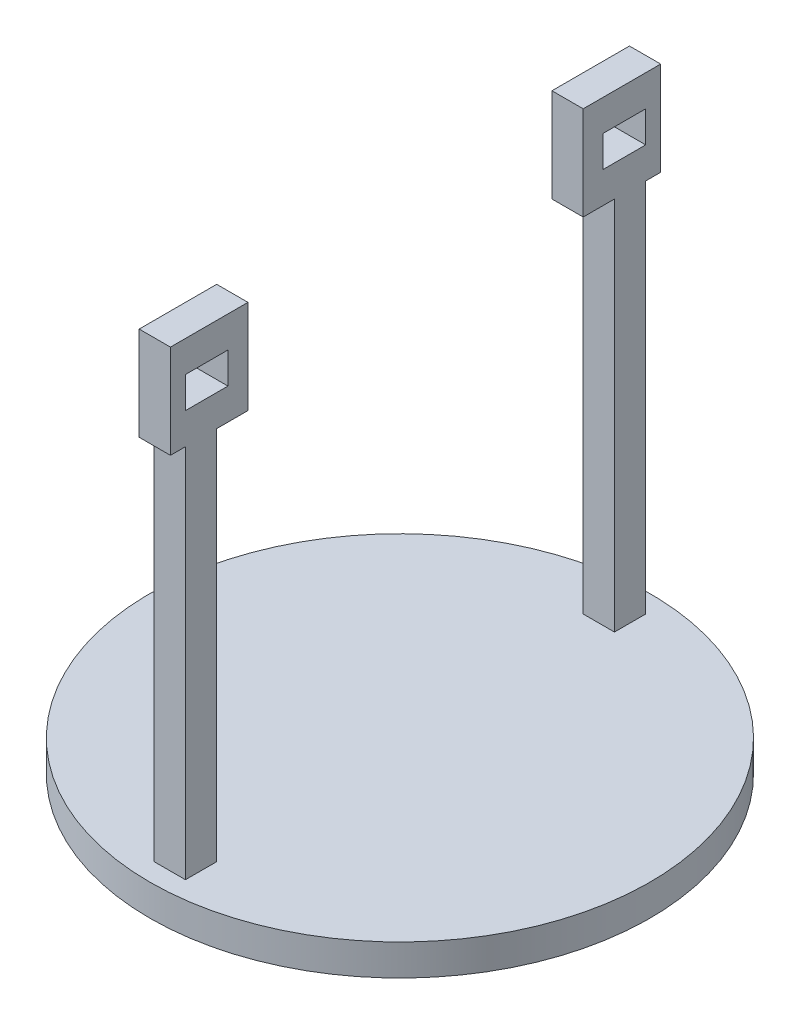
ISO-10303-21;
HEADER;
FILE_DESCRIPTION(('STEP AP214'),'2;1');
FILE_NAME('part.step','',(''),(''),'','','');
FILE_SCHEMA(('AUTOMOTIVE_DESIGN { 1 0 10303 214 1 1 1 1 }'));
ENDSEC;
DATA;
#1=APPLICATION_CONTEXT('core data for automotive mechanical design processes');
#2=APPLICATION_PROTOCOL_DEFINITION('international standard','automotive_design',2000,#1);
#3=PRODUCT_CONTEXT('',#1,'mechanical');
#4=PRODUCT('Part','Part','',(#3));
#5=PRODUCT_RELATED_PRODUCT_CATEGORY('part','',(#4));
#6=PRODUCT_DEFINITION_FORMATION('','',#4);
#7=PRODUCT_DEFINITION_CONTEXT('part definition',#1,'design');
#8=PRODUCT_DEFINITION('design','',#6,#7);
#9=PRODUCT_DEFINITION_SHAPE('','',#8);
#10=(LENGTH_UNIT() NAMED_UNIT(*) SI_UNIT(.MILLI.,.METRE.));
#11=(NAMED_UNIT(*) PLANE_ANGLE_UNIT() SI_UNIT($,.RADIAN.));
#12=(NAMED_UNIT(*) SI_UNIT($,.STERADIAN.) SOLID_ANGLE_UNIT());
#13=UNCERTAINTY_MEASURE_WITH_UNIT(LENGTH_MEASURE(1.E-05),#10,'distance_accuracy_value','');
#14=(GEOMETRIC_REPRESENTATION_CONTEXT(3) GLOBAL_UNCERTAINTY_ASSIGNED_CONTEXT((#13)) GLOBAL_UNIT_ASSIGNED_CONTEXT((#10,
#11,#12)) REPRESENTATION_CONTEXT('',''));
#15=CARTESIAN_POINT('',(0.,0.,0.));
#16=DIRECTION('',(0.,0.,1.));
#17=DIRECTION('',(1.,0.,0.));
#18=AXIS2_PLACEMENT_3D('',#15,#16,#17);
#19=CARTESIAN_POINT('',(0.,6.35,0.));
#20=DIRECTION('',(0.,-1.,0.));
#21=DIRECTION('',(0.,0.,-1.));
#22=AXIS2_PLACEMENT_3D('',#19,#20,#21);
#23=CYLINDRICAL_SURFACE('',#22,50.8);
#24=CARTESIAN_POINT('',(0.,6.35,0.));
#25=DIRECTION('',(0.,1.,0.));
#26=DIRECTION('',(0.,0.,1.));
#27=AXIS2_PLACEMENT_3D('',#24,#25,#26);
#28=CIRCLE('',#27,50.8);
#29=CARTESIAN_POINT('',(0.,6.35,50.8));
#30=VERTEX_POINT('',#29);
#31=EDGE_CURVE('E11',#30,#30,#28,.T.);
#32=ORIENTED_EDGE('',*,*,#31,.F.);
#33=EDGE_LOOP('',(#32));
#34=FACE_BOUND('',#33,.T.);
#35=CARTESIAN_POINT('',(0.,0.,0.));
#36=DIRECTION('',(0.,1.,0.));
#37=DIRECTION('',(0.,0.,1.));
#38=AXIS2_PLACEMENT_3D('',#35,#36,#37);
#39=CIRCLE('',#38,50.8);
#40=CARTESIAN_POINT('',(0.,0.,50.8));
#41=VERTEX_POINT('',#40);
#42=EDGE_CURVE('E46',#41,#41,#39,.T.);
#43=ORIENTED_EDGE('',*,*,#42,.T.);
#44=EDGE_LOOP('',(#43));
#45=FACE_BOUND('',#44,.T.);
#46=ADVANCED_FACE('F43',(#34,#45),#23,.T.);
#47=CARTESIAN_POINT('',(0.,6.35,0.));
#48=DIRECTION('',(0.,1.,0.));
#49=DIRECTION('',(0.,0.,1.));
#50=AXIS2_PLACEMENT_3D('',#47,#48,#49);
#51=PLANE('',#50);
#52=DIRECTION('',(0.,0.,1.));
#53=VECTOR('',#52,1.);
#54=CARTESIAN_POINT('',(3.175,6.35000000000002,0.));
#55=LINE('',#54,#53);
#56=CARTESIAN_POINT('',(3.175,6.35000000000002,40.408352));
#57=VERTEX_POINT('',#56);
#58=CARTESIAN_POINT('',(3.175,6.35000000000002,46.758352));
#59=VERTEX_POINT('',#58);
#60=EDGE_CURVE('E216',#57,#59,#55,.T.);
#61=ORIENTED_EDGE('',*,*,#60,.T.);
#62=DIRECTION('',(-1.,0.,0.));
#63=VECTOR('',#62,1.);
#64=CARTESIAN_POINT('',(3.175,6.35000000000002,46.758352));
#65=LINE('',#64,#63);
#66=CARTESIAN_POINT('',(-3.175,6.35000000000002,46.758352));
#67=VERTEX_POINT('',#66);
#68=EDGE_CURVE('E383',#59,#67,#65,.T.);
#69=ORIENTED_EDGE('',*,*,#68,.T.);
#70=DIRECTION('',(0.,0.,1.));
#71=VECTOR('',#70,1.);
#72=CARTESIAN_POINT('',(-3.175,6.35000000000002,0.));
#73=LINE('',#72,#71);
#74=CARTESIAN_POINT('',(-3.175,6.35,40.408352));
#75=VERTEX_POINT('',#74);
#76=EDGE_CURVE('E232',#75,#67,#73,.T.);
#77=ORIENTED_EDGE('',*,*,#76,.F.);
#78=DIRECTION('',(-1.,0.,0.));
#79=VECTOR('',#78,1.);
#80=CARTESIAN_POINT('',(3.175,6.35000000000002,40.408352));
#81=LINE('',#80,#79);
#82=EDGE_CURVE('E208',#57,#75,#81,.T.);
#83=ORIENTED_EDGE('',*,*,#82,.F.);
#84=EDGE_LOOP('',(#61,#69,#77,#83));
#85=FACE_BOUND('',#84,.T.);
#86=DIRECTION('',(0.,0.,-1.));
#87=VECTOR('',#86,1.);
#88=CARTESIAN_POINT('',(3.175,6.35000000000002,0.));
#89=LINE('',#88,#87);
#90=CARTESIAN_POINT('',(3.175,6.35000000000002,-40.408352));
#91=VERTEX_POINT('',#90);
#92=CARTESIAN_POINT('',(3.175,6.35000000000002,-46.758352));
#93=VERTEX_POINT('',#92);
#94=EDGE_CURVE('E244',#91,#93,#89,.T.);
#95=ORIENTED_EDGE('',*,*,#94,.F.);
#96=DIRECTION('',(-1.,0.,0.));
#97=VECTOR('',#96,1.);
#98=CARTESIAN_POINT('',(3.175,6.35000000000002,-40.408352));
#99=LINE('',#98,#97);
#100=CARTESIAN_POINT('',(-3.175,6.35000000000002,-40.408352));
#101=VERTEX_POINT('',#100);
#102=EDGE_CURVE('E285',#91,#101,#99,.T.);
#103=ORIENTED_EDGE('',*,*,#102,.T.);
#104=DIRECTION('',(0.,0.,-1.));
#105=VECTOR('',#104,1.);
#106=CARTESIAN_POINT('',(-3.175,6.35000000000002,0.));
#107=LINE('',#106,#105);
#108=CARTESIAN_POINT('',(-3.175,6.35,-46.758352));
#109=VERTEX_POINT('',#108);
#110=EDGE_CURVE('E286',#101,#109,#107,.T.);
#111=ORIENTED_EDGE('',*,*,#110,.T.);
#112=DIRECTION('',(-1.,0.,0.));
#113=VECTOR('',#112,1.);
#114=CARTESIAN_POINT('',(3.175,6.35000000000002,-46.758352));
#115=LINE('',#114,#113);
#116=EDGE_CURVE('E66',#93,#109,#115,.T.);
#117=ORIENTED_EDGE('',*,*,#116,.F.);
#118=EDGE_LOOP('',(#95,#103,#111,#117));
#119=FACE_BOUND('',#118,.T.);
#120=ORIENTED_EDGE('',*,*,#31,.T.);
#121=EDGE_LOOP('',(#120));
#122=FACE_BOUND('',#121,.T.);
#123=ADVANCED_FACE('F230',(#85,#119,#122),#51,.T.);
#124=CARTESIAN_POINT('',(0.,0.,0.));
#125=DIRECTION('',(0.,1.,0.));
#126=DIRECTION('',(0.,0.,1.));
#127=AXIS2_PLACEMENT_3D('',#124,#125,#126);
#128=PLANE('',#127);
#129=ORIENTED_EDGE('',*,*,#42,.F.);
#130=EDGE_LOOP('',(#129));
#131=FACE_BOUND('',#130,.T.);
#132=ADVANCED_FACE('F519',(#131),#128,.F.);
#133=CARTESIAN_POINT('',(3.175,0.,-46.758352));
#134=DIRECTION('',(0.,0.,1.));
#135=DIRECTION('',(1.,0.,0.));
#136=AXIS2_PLACEMENT_3D('',#133,#134,#135);
#137=PLANE('',#136);
#138=DIRECTION('',(0.,1.,0.));
#139=VECTOR('',#138,1.);
#140=CARTESIAN_POINT('',(-3.175,0.,-46.758352));
#141=LINE('',#140,#139);
#142=CARTESIAN_POINT('',(-3.175,88.9,-46.758352));
#143=VERTEX_POINT('',#142);
#144=CARTESIAN_POINT('',(-3.175,95.25,-46.758352));
#145=VERTEX_POINT('',#144);
#146=EDGE_CURVE('E313',#143,#145,#141,.T.);
#147=ORIENTED_EDGE('',*,*,#146,.F.);
#148=DIRECTION('',(-1.,0.,0.));
#149=VECTOR('',#148,1.);
#150=CARTESIAN_POINT('',(3.175,88.9,-46.758352));
#151=LINE('',#150,#149);
#152=CARTESIAN_POINT('',(3.175,88.9,-46.758352));
#153=VERTEX_POINT('',#152);
#154=EDGE_CURVE('E338',#153,#143,#151,.T.);
#155=ORIENTED_EDGE('',*,*,#154,.F.);
#156=DIRECTION('',(0.,1.,0.));
#157=VECTOR('',#156,1.);
#158=CARTESIAN_POINT('',(3.175,0.,-46.758352));
#159=LINE('',#158,#157);
#160=CARTESIAN_POINT('',(3.175,95.25,-46.758352));
#161=VERTEX_POINT('',#160);
#162=EDGE_CURVE('E270',#153,#161,#159,.T.);
#163=ORIENTED_EDGE('',*,*,#162,.T.);
#164=DIRECTION('',(-1.,0.,0.));
#165=VECTOR('',#164,1.);
#166=CARTESIAN_POINT('',(3.175,95.25,-46.758352));
#167=LINE('',#166,#165);
#168=EDGE_CURVE('E328',#161,#145,#167,.T.);
#169=ORIENTED_EDGE('',*,*,#168,.T.);
#170=EDGE_LOOP('',(#147,#155,#163,#169));
#171=FACE_BOUND('',#170,.T.);
#172=ADVANCED_FACE('F528',(#171),#137,.T.);
#173=CARTESIAN_POINT('',(3.175,88.9,0.));
#174=DIRECTION('',(0.,-1.,0.));
#175=DIRECTION('',(0.,0.,-1.));
#176=AXIS2_PLACEMENT_3D('',#173,#174,#175);
#177=PLANE('',#176);
#178=DIRECTION('',(0.,0.,1.));
#179=VECTOR('',#178,1.);
#180=CARTESIAN_POINT('',(-3.175,88.9,0.));
#181=LINE('',#180,#179);
#182=CARTESIAN_POINT('',(-3.175,88.9,-38.122352));
#183=VERTEX_POINT('',#182);
#184=EDGE_CURVE('E317',#143,#183,#181,.T.);
#185=ORIENTED_EDGE('',*,*,#184,.T.);
#186=DIRECTION('',(-1.,0.,0.));
#187=VECTOR('',#186,1.);
#188=CARTESIAN_POINT('',(3.175,88.9,-38.122352));
#189=LINE('',#188,#187);
#190=CARTESIAN_POINT('',(3.175,88.9,-38.122352));
#191=VERTEX_POINT('',#190);
#192=EDGE_CURVE('E334',#191,#183,#189,.T.);
#193=ORIENTED_EDGE('',*,*,#192,.F.);
#194=DIRECTION('',(0.,0.,1.));
#195=VECTOR('',#194,1.);
#196=CARTESIAN_POINT('',(3.175,88.9,0.));
#197=LINE('',#196,#195);
#198=EDGE_CURVE('E274',#153,#191,#197,.T.);
#199=ORIENTED_EDGE('',*,*,#198,.F.);
#200=ORIENTED_EDGE('',*,*,#154,.T.);
#201=EDGE_LOOP('',(#185,#193,#199,#200));
#202=FACE_BOUND('',#201,.T.);
#203=ADVANCED_FACE('F532',(#202),#177,.F.);
#204=CARTESIAN_POINT('',(3.175,0.,-38.122352));
#205=DIRECTION('',(0.,0.,1.));
#206=DIRECTION('',(1.,0.,0.));
#207=AXIS2_PLACEMENT_3D('',#204,#205,#206);
#208=PLANE('',#207);
#209=DIRECTION('',(0.,1.,0.));
#210=VECTOR('',#209,1.);
#211=CARTESIAN_POINT('',(-3.175,0.,-38.122352));
#212=LINE('',#211,#210);
#213=CARTESIAN_POINT('',(-3.175,95.25,-38.122352));
#214=VERTEX_POINT('',#213);
#215=EDGE_CURVE('E321',#183,#214,#212,.T.);
#216=ORIENTED_EDGE('',*,*,#215,.T.);
#217=DIRECTION('',(-1.,0.,0.));
#218=VECTOR('',#217,1.);
#219=CARTESIAN_POINT('',(3.175,95.25,-38.122352));
#220=LINE('',#219,#218);
#221=CARTESIAN_POINT('',(3.175,95.25,-38.122352));
#222=VERTEX_POINT('',#221);
#223=EDGE_CURVE('E331',#222,#214,#220,.T.);
#224=ORIENTED_EDGE('',*,*,#223,.F.);
#225=DIRECTION('',(0.,1.,0.));
#226=VECTOR('',#225,1.);
#227=CARTESIAN_POINT('',(3.175,0.,-38.122352));
#228=LINE('',#227,#226);
#229=EDGE_CURVE('E278',#191,#222,#228,.T.);
#230=ORIENTED_EDGE('',*,*,#229,.F.);
#231=ORIENTED_EDGE('',*,*,#192,.T.);
#232=EDGE_LOOP('',(#216,#224,#230,#231));
#233=FACE_BOUND('',#232,.T.);
#234=ADVANCED_FACE('F540',(#233),#208,.F.);
#235=CARTESIAN_POINT('',(3.175,0.,-46.758352));
#236=DIRECTION('',(0.,0.,1.));
#237=DIRECTION('',(1.,0.,0.));
#238=AXIS2_PLACEMENT_3D('',#235,#236,#237);
#239=PLANE('',#238);
#240=DIRECTION('',(0.,1.,0.));
#241=VECTOR('',#240,1.);
#242=CARTESIAN_POINT('',(-3.175,0.,-46.758352));
#243=LINE('',#242,#241);
#244=CARTESIAN_POINT('',(-3.175,82.55,-46.758352));
#245=VERTEX_POINT('',#244);
#246=EDGE_CURVE('E290',#109,#245,#243,.T.);
#247=ORIENTED_EDGE('',*,*,#246,.T.);
#248=DIRECTION('',(-1.,0.,0.));
#249=VECTOR('',#248,1.);
#250=CARTESIAN_POINT('',(3.175,82.55,-46.758352));
#251=LINE('',#250,#249);
#252=CARTESIAN_POINT('',(3.175,82.55,-46.758352));
#253=VERTEX_POINT('',#252);
#254=EDGE_CURVE('E361',#253,#245,#251,.T.);
#255=ORIENTED_EDGE('',*,*,#254,.F.);
#256=DIRECTION('',(0.,1.,0.));
#257=VECTOR('',#256,1.);
#258=CARTESIAN_POINT('',(3.175,0.,-46.758352));
#259=LINE('',#258,#257);
#260=EDGE_CURVE('E248',#93,#253,#259,.T.);
#261=ORIENTED_EDGE('',*,*,#260,.F.);
#262=ORIENTED_EDGE('',*,*,#116,.T.);
#263=EDGE_LOOP('',(#247,#255,#261,#262));
#264=FACE_BOUND('',#263,.T.);
#265=ADVANCED_FACE('F536',(#264),#239,.F.);
#266=CARTESIAN_POINT('',(3.175,82.55,0.));
#267=DIRECTION('',(0.,1.,0.));
#268=DIRECTION('',(0.,0.,1.));
#269=AXIS2_PLACEMENT_3D('',#266,#267,#268);
#270=PLANE('',#269);
#271=DIRECTION('',(0.,0.,-1.));
#272=VECTOR('',#271,1.);
#273=CARTESIAN_POINT('',(-3.175,82.55,0.));
#274=LINE('',#273,#272);
#275=CARTESIAN_POINT('',(-3.175,82.55,-49.806352));
#276=VERTEX_POINT('',#275);
#277=EDGE_CURVE('E294',#245,#276,#274,.T.);
#278=ORIENTED_EDGE('',*,*,#277,.T.);
#279=DIRECTION('',(-1.,0.,0.));
#280=VECTOR('',#279,1.);
#281=CARTESIAN_POINT('',(3.175,82.55,-49.806352));
#282=LINE('',#281,#280);
#283=CARTESIAN_POINT('',(3.175,82.55,-49.806352));
#284=VERTEX_POINT('',#283);
#285=EDGE_CURVE('E357',#284,#276,#282,.T.);
#286=ORIENTED_EDGE('',*,*,#285,.F.);
#287=DIRECTION('',(0.,0.,-1.));
#288=VECTOR('',#287,1.);
#289=CARTESIAN_POINT('',(3.175,82.55,0.));
#290=LINE('',#289,#288);
#291=EDGE_CURVE('E252',#253,#284,#290,.T.);
#292=ORIENTED_EDGE('',*,*,#291,.F.);
#293=ORIENTED_EDGE('',*,*,#254,.T.);
#294=EDGE_LOOP('',(#278,#286,#292,#293));
#295=FACE_BOUND('',#294,.T.);
#296=ADVANCED_FACE('F539',(#295),#270,.F.);
#297=CARTESIAN_POINT('',(3.175,0.,-49.806352));
#298=DIRECTION('',(0.,0.,1.));
#299=DIRECTION('',(1.,0.,0.));
#300=AXIS2_PLACEMENT_3D('',#297,#298,#299);
#301=PLANE('',#300);
#302=DIRECTION('',(0.,1.,0.));
#303=VECTOR('',#302,1.);
#304=CARTESIAN_POINT('',(-3.175,0.,-49.806352));
#305=LINE('',#304,#303);
#306=CARTESIAN_POINT('',(-3.175,101.6,-49.806352));
#307=VERTEX_POINT('',#306);
#308=EDGE_CURVE('E297',#276,#307,#305,.T.);
#309=ORIENTED_EDGE('',*,*,#308,.T.);
#310=DIRECTION('',(-1.,0.,0.));
#311=VECTOR('',#310,1.);
#312=CARTESIAN_POINT('',(3.175,101.6,-49.806352));
#313=LINE('',#312,#311);
#314=CARTESIAN_POINT('',(3.175,101.6,-49.806352));
#315=VERTEX_POINT('',#314);
#316=EDGE_CURVE('E353',#315,#307,#313,.T.);
#317=ORIENTED_EDGE('',*,*,#316,.F.);
#318=DIRECTION('',(0.,1.,0.));
#319=VECTOR('',#318,1.);
#320=CARTESIAN_POINT('',(3.175,0.,-49.806352));
#321=LINE('',#320,#319);
#322=EDGE_CURVE('E255',#284,#315,#321,.T.);
#323=ORIENTED_EDGE('',*,*,#322,.F.);
#324=ORIENTED_EDGE('',*,*,#285,.T.);
#325=EDGE_LOOP('',(#309,#317,#323,#324));
#326=FACE_BOUND('',#325,.T.);
#327=ADVANCED_FACE('F541',(#326),#301,.F.);
#328=CARTESIAN_POINT('',(3.175,101.6,0.));
#329=DIRECTION('',(0.,-1.,0.));
#330=DIRECTION('',(0.,0.,-1.));
#331=AXIS2_PLACEMENT_3D('',#328,#329,#330);
#332=PLANE('',#331);
#333=DIRECTION('',(0.,0.,1.));
#334=VECTOR('',#333,1.);
#335=CARTESIAN_POINT('',(-3.175,101.6,0.));
#336=LINE('',#335,#334);
#337=CARTESIAN_POINT('',(-3.175,101.6,-34.058352));
#338=VERTEX_POINT('',#337);
#339=EDGE_CURVE('E301',#307,#338,#336,.T.);
#340=ORIENTED_EDGE('',*,*,#339,.T.);
#341=DIRECTION('',(-1.,0.,0.));
#342=VECTOR('',#341,1.);
#343=CARTESIAN_POINT('',(3.175,101.6,-34.058352));
#344=LINE('',#343,#342);
#345=CARTESIAN_POINT('',(3.175,101.6,-34.058352));
#346=VERTEX_POINT('',#345);
#347=EDGE_CURVE('E350',#346,#338,#344,.T.);
#348=ORIENTED_EDGE('',*,*,#347,.F.);
#349=DIRECTION('',(0.,0.,1.));
#350=VECTOR('',#349,1.);
#351=CARTESIAN_POINT('',(3.175,101.6,0.));
#352=LINE('',#351,#350);
#353=EDGE_CURVE('E259',#315,#346,#352,.T.);
#354=ORIENTED_EDGE('',*,*,#353,.F.);
#355=ORIENTED_EDGE('',*,*,#316,.T.);
#356=EDGE_LOOP('',(#340,#348,#354,#355));
#357=FACE_BOUND('',#356,.T.);
#358=ADVANCED_FACE('F544',(#357),#332,.F.);
#359=CARTESIAN_POINT('',(3.175,0.,-34.058352));
#360=DIRECTION('',(0.,0.,1.));
#361=DIRECTION('',(1.,0.,0.));
#362=AXIS2_PLACEMENT_3D('',#359,#360,#361);
#363=PLANE('',#362);
#364=DIRECTION('',(0.,1.,0.));
#365=VECTOR('',#364,1.);
#366=CARTESIAN_POINT('',(-3.175,0.,-34.058352));
#367=LINE('',#366,#365);
#368=CARTESIAN_POINT('',(-3.175,82.55,-34.058352));
#369=VERTEX_POINT('',#368);
#370=EDGE_CURVE('E305',#369,#338,#367,.T.);
#371=ORIENTED_EDGE('',*,*,#370,.F.);
#372=DIRECTION('',(-1.,0.,0.));
#373=VECTOR('',#372,1.);
#374=CARTESIAN_POINT('',(3.175,82.55,-34.058352));
#375=LINE('',#374,#373);
#376=CARTESIAN_POINT('',(3.175,82.55,-34.058352));
#377=VERTEX_POINT('',#376);
#378=EDGE_CURVE('E347',#377,#369,#375,.T.);
#379=ORIENTED_EDGE('',*,*,#378,.F.);
#380=DIRECTION('',(0.,1.,0.));
#381=VECTOR('',#380,1.);
#382=CARTESIAN_POINT('',(3.175,0.,-34.058352));
#383=LINE('',#382,#381);
#384=EDGE_CURVE('E262',#377,#346,#383,.T.);
#385=ORIENTED_EDGE('',*,*,#384,.T.);
#386=ORIENTED_EDGE('',*,*,#347,.T.);
#387=EDGE_LOOP('',(#371,#379,#385,#386));
#388=FACE_BOUND('',#387,.T.);
#389=ADVANCED_FACE('F548',(#388),#363,.T.);
#390=CARTESIAN_POINT('',(-3.175,82.55,-40.408352));
#391=VERTEX_POINT('',#390);
#392=EDGE_CURVE('E298',#369,#391,#274,.T.);
#393=ORIENTED_EDGE('',*,*,#392,.T.);
#394=DIRECTION('',(-1.,0.,0.));
#395=VECTOR('',#394,1.);
#396=CARTESIAN_POINT('',(3.175,82.55,-40.408352));
#397=LINE('',#396,#395);
#398=CARTESIAN_POINT('',(3.175,82.55,-40.408352));
#399=VERTEX_POINT('',#398);
#400=EDGE_CURVE('E344',#399,#391,#397,.T.);
#401=ORIENTED_EDGE('',*,*,#400,.F.);
#402=EDGE_CURVE('E256',#377,#399,#290,.T.);
#403=ORIENTED_EDGE('',*,*,#402,.F.);
#404=ORIENTED_EDGE('',*,*,#378,.T.);
#405=EDGE_LOOP('',(#393,#401,#403,#404));
#406=FACE_BOUND('',#405,.T.);
#407=ADVANCED_FACE('F552',(#406),#270,.F.);
#408=CARTESIAN_POINT('',(3.175,0.,-40.408352));
#409=DIRECTION('',(0.,0.,1.));
#410=DIRECTION('',(1.,0.,0.));
#411=AXIS2_PLACEMENT_3D('',#408,#409,#410);
#412=PLANE('',#411);
#413=DIRECTION('',(0.,1.,0.));
#414=VECTOR('',#413,1.);
#415=CARTESIAN_POINT('',(-3.175,0.,-40.408352));
#416=LINE('',#415,#414);
#417=EDGE_CURVE('E309',#101,#391,#416,.T.);
#418=ORIENTED_EDGE('',*,*,#417,.F.);
#419=ORIENTED_EDGE('',*,*,#102,.F.);
#420=DIRECTION('',(0.,1.,0.));
#421=VECTOR('',#420,1.);
#422=CARTESIAN_POINT('',(3.175,0.,-40.408352));
#423=LINE('',#422,#421);
#424=EDGE_CURVE('E266',#91,#399,#423,.T.);
#425=ORIENTED_EDGE('',*,*,#424,.T.);
#426=ORIENTED_EDGE('',*,*,#400,.T.);
#427=EDGE_LOOP('',(#418,#419,#425,#426));
#428=FACE_BOUND('',#427,.T.);
#429=ADVANCED_FACE('F556',(#428),#412,.T.);
#430=CARTESIAN_POINT('',(3.175,95.25,0.));
#431=DIRECTION('',(0.,-1.,0.));
#432=DIRECTION('',(0.,0.,-1.));
#433=AXIS2_PLACEMENT_3D('',#430,#431,#432);
#434=PLANE('',#433);
#435=DIRECTION('',(0.,0.,1.));
#436=VECTOR('',#435,1.);
#437=CARTESIAN_POINT('',(-3.175,95.25,0.));
#438=LINE('',#437,#436);
#439=EDGE_CURVE('E249',#145,#214,#438,.T.);
#440=ORIENTED_EDGE('',*,*,#439,.F.);
#441=ORIENTED_EDGE('',*,*,#168,.F.);
#442=DIRECTION('',(0.,0.,1.));
#443=VECTOR('',#442,1.);
#444=CARTESIAN_POINT('',(3.175,95.25,0.));
#445=LINE('',#444,#443);
#446=EDGE_CURVE('E281',#161,#222,#445,.T.);
#447=ORIENTED_EDGE('',*,*,#446,.T.);
#448=ORIENTED_EDGE('',*,*,#223,.T.);
#449=EDGE_LOOP('',(#440,#441,#447,#448));
#450=FACE_BOUND('',#449,.T.);
#451=ADVANCED_FACE('F559',(#450),#434,.T.);
#452=CARTESIAN_POINT('',(3.175,0.,0.));
#453=DIRECTION('',(1.,0.,0.));
#454=DIRECTION('',(0.,0.,-1.));
#455=AXIS2_PLACEMENT_3D('',#452,#453,#454);
#456=PLANE('',#455);
#457=ORIENTED_EDGE('',*,*,#94,.T.);
#458=ORIENTED_EDGE('',*,*,#260,.T.);
#459=ORIENTED_EDGE('',*,*,#291,.T.);
#460=ORIENTED_EDGE('',*,*,#322,.T.);
#461=ORIENTED_EDGE('',*,*,#353,.T.);
#462=ORIENTED_EDGE('',*,*,#384,.F.);
#463=ORIENTED_EDGE('',*,*,#402,.T.);
#464=ORIENTED_EDGE('',*,*,#424,.F.);
#465=EDGE_LOOP('',(#457,#458,#459,#460,#461,#462,#463,#464));
#466=FACE_BOUND('',#465,.T.);
#467=ORIENTED_EDGE('',*,*,#162,.F.);
#468=ORIENTED_EDGE('',*,*,#198,.T.);
#469=ORIENTED_EDGE('',*,*,#229,.T.);
#470=ORIENTED_EDGE('',*,*,#446,.F.);
#471=EDGE_LOOP('',(#467,#468,#469,#470));
#472=FACE_BOUND('',#471,.T.);
#473=ADVANCED_FACE('F570',(#466,#472),#456,.T.);
#474=CARTESIAN_POINT('',(-3.175,0.,0.));
#475=DIRECTION('',(1.,0.,0.));
#476=DIRECTION('',(0.,0.,-1.));
#477=AXIS2_PLACEMENT_3D('',#474,#475,#476);
#478=PLANE('',#477);
#479=ORIENTED_EDGE('',*,*,#110,.F.);
#480=ORIENTED_EDGE('',*,*,#417,.T.);
#481=ORIENTED_EDGE('',*,*,#392,.F.);
#482=ORIENTED_EDGE('',*,*,#370,.T.);
#483=ORIENTED_EDGE('',*,*,#339,.F.);
#484=ORIENTED_EDGE('',*,*,#308,.F.);
#485=ORIENTED_EDGE('',*,*,#277,.F.);
#486=ORIENTED_EDGE('',*,*,#246,.F.);
#487=EDGE_LOOP('',(#479,#480,#481,#482,#483,#484,#485,#486));
#488=FACE_BOUND('',#487,.T.);
#489=ORIENTED_EDGE('',*,*,#146,.T.);
#490=ORIENTED_EDGE('',*,*,#439,.T.);
#491=ORIENTED_EDGE('',*,*,#215,.F.);
#492=ORIENTED_EDGE('',*,*,#184,.F.);
#493=EDGE_LOOP('',(#489,#490,#491,#492));
#494=FACE_BOUND('',#493,.T.);
#495=ADVANCED_FACE('F572',(#488,#494),#478,.F.);
#496=CARTESIAN_POINT('',(3.175,0.,46.758352));
#497=DIRECTION('',(0.,0.,1.));
#498=DIRECTION('',(1.,0.,0.));
#499=AXIS2_PLACEMENT_3D('',#496,#497,#498);
#500=PLANE('',#499);
#501=DIRECTION('',(0.,1.,0.));
#502=VECTOR('',#501,1.);
#503=CARTESIAN_POINT('',(-3.175,0.,46.758352));
#504=LINE('',#503,#502);
#505=CARTESIAN_POINT('',(-3.175,88.9,46.758352));
#506=VERTEX_POINT('',#505);
#507=CARTESIAN_POINT('',(-3.175,95.25,46.758352));
#508=VERTEX_POINT('',#507);
#509=EDGE_CURVE('E432',#506,#508,#504,.T.);
#510=ORIENTED_EDGE('',*,*,#509,.T.);
#511=DIRECTION('',(-1.,0.,0.));
#512=VECTOR('',#511,1.);
#513=CARTESIAN_POINT('',(3.175,95.25,46.758352));
#514=LINE('',#513,#512);
#515=CARTESIAN_POINT('',(3.175,95.25,46.758352));
#516=VERTEX_POINT('',#515);
#517=EDGE_CURVE('E291',#516,#508,#514,.T.);
#518=ORIENTED_EDGE('',*,*,#517,.F.);
#519=DIRECTION('',(0.,1.,0.));
#520=VECTOR('',#519,1.);
#521=CARTESIAN_POINT('',(3.175,0.,46.758352));
#522=LINE('',#521,#520);
#523=CARTESIAN_POINT('',(3.175,88.9,46.758352));
#524=VERTEX_POINT('',#523);
#525=EDGE_CURVE('E458',#524,#516,#522,.T.);
#526=ORIENTED_EDGE('',*,*,#525,.F.);
#527=DIRECTION('',(-1.,0.,0.));
#528=VECTOR('',#527,1.);
#529=CARTESIAN_POINT('',(3.175,88.9,46.758352));
#530=LINE('',#529,#528);
#531=EDGE_CURVE('E234',#524,#506,#530,.T.);
#532=ORIENTED_EDGE('',*,*,#531,.T.);
#533=EDGE_LOOP('',(#510,#518,#526,#532));
#534=FACE_BOUND('',#533,.T.);
#535=ADVANCED_FACE('F459',(#534),#500,.F.);
#536=CARTESIAN_POINT('',(3.175,95.25,0.));
#537=DIRECTION('',(0.,1.,0.));
#538=DIRECTION('',(0.,0.,1.));
#539=AXIS2_PLACEMENT_3D('',#536,#537,#538);
#540=PLANE('',#539);
#541=DIRECTION('',(0.,0.,-1.));
#542=VECTOR('',#541,1.);
#543=CARTESIAN_POINT('',(-3.175,95.25,0.));
#544=LINE('',#543,#542);
#545=CARTESIAN_POINT('',(-3.175,95.25,38.122352));
#546=VERTEX_POINT('',#545);
#547=EDGE_CURVE('E442',#508,#546,#544,.T.);
#548=ORIENTED_EDGE('',*,*,#547,.T.);
#549=DIRECTION('',(-1.,0.,0.));
#550=VECTOR('',#549,1.);
#551=CARTESIAN_POINT('',(3.175,95.25,38.122352));
#552=LINE('',#551,#550);
#553=CARTESIAN_POINT('',(3.175,95.25,38.122352));
#554=VERTEX_POINT('',#553);
#555=EDGE_CURVE('E372',#554,#546,#552,.T.);
#556=ORIENTED_EDGE('',*,*,#555,.F.);
#557=DIRECTION('',(0.,0.,-1.));
#558=VECTOR('',#557,1.);
#559=CARTESIAN_POINT('',(3.175,95.25,0.));
#560=LINE('',#559,#558);
#561=EDGE_CURVE('E461',#516,#554,#560,.T.);
#562=ORIENTED_EDGE('',*,*,#561,.F.);
#563=ORIENTED_EDGE('',*,*,#517,.T.);
#564=EDGE_LOOP('',(#548,#556,#562,#563));
#565=FACE_BOUND('',#564,.T.);
#566=ADVANCED_FACE('F502',(#565),#540,.F.);
#567=CARTESIAN_POINT('',(3.175,0.,38.122352));
#568=DIRECTION('',(0.,0.,1.));
#569=DIRECTION('',(1.,0.,0.));
#570=AXIS2_PLACEMENT_3D('',#567,#568,#569);
#571=PLANE('',#570);
#572=DIRECTION('',(0.,1.,0.));
#573=VECTOR('',#572,1.);
#574=CARTESIAN_POINT('',(-3.175,0.,38.122352));
#575=LINE('',#574,#573);
#576=CARTESIAN_POINT('',(-3.175,88.9,38.122352));
#577=VERTEX_POINT('',#576);
#578=EDGE_CURVE('E446',#577,#546,#575,.T.);
#579=ORIENTED_EDGE('',*,*,#578,.F.);
#580=DIRECTION('',(-1.,0.,0.));
#581=VECTOR('',#580,1.);
#582=CARTESIAN_POINT('',(3.175,88.9,38.122352));
#583=LINE('',#582,#581);
#584=CARTESIAN_POINT('',(3.175,88.9,38.122352));
#585=VERTEX_POINT('',#584);
#586=EDGE_CURVE('E238',#585,#577,#583,.T.);
#587=ORIENTED_EDGE('',*,*,#586,.F.);
#588=DIRECTION('',(0.,1.,0.));
#589=VECTOR('',#588,1.);
#590=CARTESIAN_POINT('',(3.175,0.,38.122352));
#591=LINE('',#590,#589);
#592=EDGE_CURVE('E465',#585,#554,#591,.T.);
#593=ORIENTED_EDGE('',*,*,#592,.T.);
#594=ORIENTED_EDGE('',*,*,#555,.T.);
#595=EDGE_LOOP('',(#579,#587,#593,#594));
#596=FACE_BOUND('',#595,.T.);
#597=ADVANCED_FACE('F504',(#596),#571,.T.);
#598=CARTESIAN_POINT('',(3.175,0.,40.408352));
#599=DIRECTION('',(0.,0.,1.));
#600=DIRECTION('',(1.,0.,0.));
#601=AXIS2_PLACEMENT_3D('',#598,#599,#600);
#602=PLANE('',#601);
#603=DIRECTION('',(0.,1.,0.));
#604=VECTOR('',#603,1.);
#605=CARTESIAN_POINT('',(-3.175,0.,40.408352));
#606=LINE('',#605,#604);
#607=CARTESIAN_POINT('',(-3.175,82.55,40.408352));
#608=VERTEX_POINT('',#607);
#609=EDGE_CURVE('E58',#75,#608,#606,.T.);
#610=ORIENTED_EDGE('',*,*,#609,.T.);
#611=DIRECTION('',(-1.,0.,0.));
#612=VECTOR('',#611,1.);
#613=CARTESIAN_POINT('',(3.175,82.55,40.408352));
#614=LINE('',#613,#612);
#615=CARTESIAN_POINT('',(3.175,82.55,40.408352));
#616=VERTEX_POINT('',#615);
#617=EDGE_CURVE('E210',#616,#608,#614,.T.);
#618=ORIENTED_EDGE('',*,*,#617,.F.);
#619=DIRECTION('',(0.,1.,0.));
#620=VECTOR('',#619,1.);
#621=CARTESIAN_POINT('',(3.175,0.,40.408352));
#622=LINE('',#621,#620);
#623=EDGE_CURVE('E204',#57,#616,#622,.T.);
#624=ORIENTED_EDGE('',*,*,#623,.F.);
#625=ORIENTED_EDGE('',*,*,#82,.T.);
#626=EDGE_LOOP('',(#610,#618,#624,#625));
#627=FACE_BOUND('',#626,.T.);
#628=ADVANCED_FACE('F206',(#627),#602,.F.);
#629=CARTESIAN_POINT('',(3.175,82.55,0.));
#630=DIRECTION('',(0.,-1.,0.));
#631=DIRECTION('',(0.,0.,-1.));
#632=AXIS2_PLACEMENT_3D('',#629,#630,#631);
#633=PLANE('',#632);
#634=DIRECTION('',(0.,0.,1.));
#635=VECTOR('',#634,1.);
#636=CARTESIAN_POINT('',(-3.175,82.55,0.));
#637=LINE('',#636,#635);
#638=CARTESIAN_POINT('',(-3.175,82.55,34.058352));
#639=VERTEX_POINT('',#638);
#640=EDGE_CURVE('E412',#639,#608,#637,.T.);
#641=ORIENTED_EDGE('',*,*,#640,.F.);
#642=DIRECTION('',(-1.,0.,0.));
#643=VECTOR('',#642,1.);
#644=CARTESIAN_POINT('',(3.175,82.55,34.058352));
#645=LINE('',#644,#643);
#646=CARTESIAN_POINT('',(3.175,82.55,34.058352));
#647=VERTEX_POINT('',#646);
#648=EDGE_CURVE('E240',#647,#639,#645,.T.);
#649=ORIENTED_EDGE('',*,*,#648,.F.);
#650=DIRECTION('',(0.,0.,1.));
#651=VECTOR('',#650,1.);
#652=CARTESIAN_POINT('',(3.175,82.55,0.));
#653=LINE('',#652,#651);
#654=EDGE_CURVE('E215',#647,#616,#653,.T.);
#655=ORIENTED_EDGE('',*,*,#654,.T.);
#656=ORIENTED_EDGE('',*,*,#617,.T.);
#657=EDGE_LOOP('',(#641,#649,#655,#656));
#658=FACE_BOUND('',#657,.T.);
#659=ADVANCED_FACE('F418',(#658),#633,.T.);
#660=CARTESIAN_POINT('',(3.175,0.,34.058352));
#661=DIRECTION('',(0.,0.,1.));
#662=DIRECTION('',(1.,0.,0.));
#663=AXIS2_PLACEMENT_3D('',#660,#661,#662);
#664=PLANE('',#663);
#665=DIRECTION('',(0.,1.,0.));
#666=VECTOR('',#665,1.);
#667=CARTESIAN_POINT('',(-3.175,0.,34.058352));
#668=LINE('',#667,#666);
#669=CARTESIAN_POINT('',(-3.175,101.6,34.058352));
#670=VERTEX_POINT('',#669);
#671=EDGE_CURVE('E405',#639,#670,#668,.T.);
#672=ORIENTED_EDGE('',*,*,#671,.T.);
#673=DIRECTION('',(-1.,0.,0.));
#674=VECTOR('',#673,1.);
#675=CARTESIAN_POINT('',(3.175,101.6,34.058352));
#676=LINE('',#675,#674);
#677=CARTESIAN_POINT('',(3.175,101.6,34.058352));
#678=VERTEX_POINT('',#677);
#679=EDGE_CURVE('E396',#678,#670,#676,.T.);
#680=ORIENTED_EDGE('',*,*,#679,.F.);
#681=DIRECTION('',(0.,1.,0.));
#682=VECTOR('',#681,1.);
#683=CARTESIAN_POINT('',(3.175,0.,34.058352));
#684=LINE('',#683,#682);
#685=EDGE_CURVE('E407',#647,#678,#684,.T.);
#686=ORIENTED_EDGE('',*,*,#685,.F.);
#687=ORIENTED_EDGE('',*,*,#648,.T.);
#688=EDGE_LOOP('',(#672,#680,#686,#687));
#689=FACE_BOUND('',#688,.T.);
#690=ADVANCED_FACE('F403',(#689),#664,.F.);
#691=CARTESIAN_POINT('',(3.175,101.6,0.));
#692=DIRECTION('',(0.,1.,0.));
#693=DIRECTION('',(0.,0.,1.));
#694=AXIS2_PLACEMENT_3D('',#691,#692,#693);
#695=PLANE('',#694);
#696=DIRECTION('',(0.,0.,-1.));
#697=VECTOR('',#696,1.);
#698=CARTESIAN_POINT('',(-3.175,101.6,0.));
#699=LINE('',#698,#697);
#700=CARTESIAN_POINT('',(-3.175,101.6,49.806352));
#701=VERTEX_POINT('',#700);
#702=EDGE_CURVE('E415',#701,#670,#699,.T.);
#703=ORIENTED_EDGE('',*,*,#702,.F.);
#704=DIRECTION('',(-1.,0.,0.));
#705=VECTOR('',#704,1.);
#706=CARTESIAN_POINT('',(3.175,101.6,49.806352));
#707=LINE('',#706,#705);
#708=CARTESIAN_POINT('',(3.175,101.6,49.806352));
#709=VERTEX_POINT('',#708);
#710=EDGE_CURVE('E393',#709,#701,#707,.T.);
#711=ORIENTED_EDGE('',*,*,#710,.F.);
#712=DIRECTION('',(0.,0.,-1.));
#713=VECTOR('',#712,1.);
#714=CARTESIAN_POINT('',(3.175,101.6,0.));
#715=LINE('',#714,#713);
#716=EDGE_CURVE('E489',#709,#678,#715,.T.);
#717=ORIENTED_EDGE('',*,*,#716,.T.);
#718=ORIENTED_EDGE('',*,*,#679,.T.);
#719=EDGE_LOOP('',(#703,#711,#717,#718));
#720=FACE_BOUND('',#719,.T.);
#721=ADVANCED_FACE('F488',(#720),#695,.T.);
#722=CARTESIAN_POINT('',(3.175,0.,49.806352));
#723=DIRECTION('',(0.,0.,1.));
#724=DIRECTION('',(1.,0.,0.));
#725=AXIS2_PLACEMENT_3D('',#722,#723,#724);
#726=PLANE('',#725);
#727=DIRECTION('',(0.,1.,0.));
#728=VECTOR('',#727,1.);
#729=CARTESIAN_POINT('',(-3.175,0.,49.806352));
#730=LINE('',#729,#728);
#731=CARTESIAN_POINT('',(-3.175,82.55,49.806352));
#732=VERTEX_POINT('',#731);
#733=EDGE_CURVE('E427',#732,#701,#730,.T.);
#734=ORIENTED_EDGE('',*,*,#733,.F.);
#735=DIRECTION('',(-1.,0.,0.));
#736=VECTOR('',#735,1.);
#737=CARTESIAN_POINT('',(3.175,82.55,49.806352));
#738=LINE('',#737,#736);
#739=CARTESIAN_POINT('',(3.175,82.55,49.806352));
#740=VERTEX_POINT('',#739);
#741=EDGE_CURVE('E390',#740,#732,#738,.T.);
#742=ORIENTED_EDGE('',*,*,#741,.F.);
#743=DIRECTION('',(0.,1.,0.));
#744=VECTOR('',#743,1.);
#745=CARTESIAN_POINT('',(3.175,0.,49.806352));
#746=LINE('',#745,#744);
#747=EDGE_CURVE('E484',#740,#709,#746,.T.);
#748=ORIENTED_EDGE('',*,*,#747,.T.);
#749=ORIENTED_EDGE('',*,*,#710,.T.);
#750=EDGE_LOOP('',(#734,#742,#748,#749));
#751=FACE_BOUND('',#750,.T.);
#752=ADVANCED_FACE('F483',(#751),#726,.T.);
#753=CARTESIAN_POINT('',(-3.175,82.55,46.758352));
#754=VERTEX_POINT('',#753);
#755=EDGE_CURVE('E421',#754,#732,#637,.T.);
#756=ORIENTED_EDGE('',*,*,#755,.F.);
#757=DIRECTION('',(-1.,0.,0.));
#758=VECTOR('',#757,1.);
#759=CARTESIAN_POINT('',(3.175,82.55,46.758352));
#760=LINE('',#759,#758);
#761=CARTESIAN_POINT('',(3.175,82.55,46.758352));
#762=VERTEX_POINT('',#761);
#763=EDGE_CURVE('E386',#762,#754,#760,.T.);
#764=ORIENTED_EDGE('',*,*,#763,.F.);
#765=EDGE_CURVE('E479',#762,#740,#653,.T.);
#766=ORIENTED_EDGE('',*,*,#765,.T.);
#767=ORIENTED_EDGE('',*,*,#741,.T.);
#768=EDGE_LOOP('',(#756,#764,#766,#767));
#769=FACE_BOUND('',#768,.T.);
#770=ADVANCED_FACE('F478',(#769),#633,.T.);
#771=CARTESIAN_POINT('',(3.175,0.,46.758352));
#772=DIRECTION('',(0.,0.,1.));
#773=DIRECTION('',(1.,0.,0.));
#774=AXIS2_PLACEMENT_3D('',#771,#772,#773);
#775=PLANE('',#774);
#776=DIRECTION('',(0.,1.,0.));
#777=VECTOR('',#776,1.);
#778=CARTESIAN_POINT('',(-3.175,0.,46.758352));
#779=LINE('',#778,#777);
#780=EDGE_CURVE('E426',#67,#754,#779,.T.);
#781=ORIENTED_EDGE('',*,*,#780,.F.);
#782=ORIENTED_EDGE('',*,*,#68,.F.);
#783=DIRECTION('',(0.,1.,0.));
#784=VECTOR('',#783,1.);
#785=CARTESIAN_POINT('',(3.175,0.,46.758352));
#786=LINE('',#785,#784);
#787=EDGE_CURVE('E224',#59,#762,#786,.T.);
#788=ORIENTED_EDGE('',*,*,#787,.T.);
#789=ORIENTED_EDGE('',*,*,#763,.T.);
#790=EDGE_LOOP('',(#781,#782,#788,#789));
#791=FACE_BOUND('',#790,.T.);
#792=ADVANCED_FACE('F475',(#791),#775,.T.);
#793=CARTESIAN_POINT('',(3.175,88.9,0.));
#794=DIRECTION('',(0.,1.,0.));
#795=DIRECTION('',(0.,0.,1.));
#796=AXIS2_PLACEMENT_3D('',#793,#794,#795);
#797=PLANE('',#796);
#798=DIRECTION('',(0.,0.,-1.));
#799=VECTOR('',#798,1.);
#800=CARTESIAN_POINT('',(-3.175,88.9,0.));
#801=LINE('',#800,#799);
#802=EDGE_CURVE('E228',#506,#577,#801,.T.);
#803=ORIENTED_EDGE('',*,*,#802,.F.);
#804=ORIENTED_EDGE('',*,*,#531,.F.);
#805=DIRECTION('',(0.,0.,-1.));
#806=VECTOR('',#805,1.);
#807=CARTESIAN_POINT('',(3.175,88.9,0.));
#808=LINE('',#807,#806);
#809=EDGE_CURVE('E387',#524,#585,#808,.T.);
#810=ORIENTED_EDGE('',*,*,#809,.T.);
#811=ORIENTED_EDGE('',*,*,#586,.T.);
#812=EDGE_LOOP('',(#803,#804,#810,#811));
#813=FACE_BOUND('',#812,.T.);
#814=ADVANCED_FACE('F452',(#813),#797,.T.);
#815=CARTESIAN_POINT('',(3.175,0.,0.));
#816=DIRECTION('',(1.,0.,0.));
#817=DIRECTION('',(0.,0.,1.));
#818=AXIS2_PLACEMENT_3D('',#815,#816,#817);
#819=PLANE('',#818);
#820=ORIENTED_EDGE('',*,*,#60,.F.);
#821=ORIENTED_EDGE('',*,*,#623,.T.);
#822=ORIENTED_EDGE('',*,*,#654,.F.);
#823=ORIENTED_EDGE('',*,*,#685,.T.);
#824=ORIENTED_EDGE('',*,*,#716,.F.);
#825=ORIENTED_EDGE('',*,*,#747,.F.);
#826=ORIENTED_EDGE('',*,*,#765,.F.);
#827=ORIENTED_EDGE('',*,*,#787,.F.);
#828=EDGE_LOOP('',(#820,#821,#822,#823,#824,#825,#826,#827));
#829=FACE_BOUND('',#828,.T.);
#830=ORIENTED_EDGE('',*,*,#525,.T.);
#831=ORIENTED_EDGE('',*,*,#561,.T.);
#832=ORIENTED_EDGE('',*,*,#592,.F.);
#833=ORIENTED_EDGE('',*,*,#809,.F.);
#834=EDGE_LOOP('',(#830,#831,#832,#833));
#835=FACE_BOUND('',#834,.T.);
#836=ADVANCED_FACE('F220',(#829,#835),#819,.T.);
#837=CARTESIAN_POINT('',(-3.175,0.,0.));
#838=DIRECTION('',(1.,0.,0.));
#839=DIRECTION('',(0.,0.,1.));
#840=AXIS2_PLACEMENT_3D('',#837,#838,#839);
#841=PLANE('',#840);
#842=ORIENTED_EDGE('',*,*,#76,.T.);
#843=ORIENTED_EDGE('',*,*,#780,.T.);
#844=ORIENTED_EDGE('',*,*,#755,.T.);
#845=ORIENTED_EDGE('',*,*,#733,.T.);
#846=ORIENTED_EDGE('',*,*,#702,.T.);
#847=ORIENTED_EDGE('',*,*,#671,.F.);
#848=ORIENTED_EDGE('',*,*,#640,.T.);
#849=ORIENTED_EDGE('',*,*,#609,.F.);
#850=EDGE_LOOP('',(#842,#843,#844,#845,#846,#847,#848,#849));
#851=FACE_BOUND('',#850,.T.);
#852=ORIENTED_EDGE('',*,*,#509,.F.);
#853=ORIENTED_EDGE('',*,*,#802,.T.);
#854=ORIENTED_EDGE('',*,*,#578,.T.);
#855=ORIENTED_EDGE('',*,*,#547,.F.);
#856=EDGE_LOOP('',(#852,#853,#854,#855));
#857=FACE_BOUND('',#856,.T.);
#858=ADVANCED_FACE('F410',(#851,#857),#841,.F.);
#859=CLOSED_SHELL('',(#46,#123,#132,#172,#203,#234,#265,#296,#327,#358,#389,#407,#429,#451,#473,
#495,#535,#566,#597,#628,#659,#690,#721,#752,#770,#792,#814,#836,#858));
#860=MANIFOLD_SOLID_BREP('B2',#859);
#861=ADVANCED_BREP_SHAPE_REPRESENTATION('',(#18,#860),#14);
#862=SHAPE_DEFINITION_REPRESENTATION(#9,#861);
ENDSEC;
END-ISO-10303-21;
